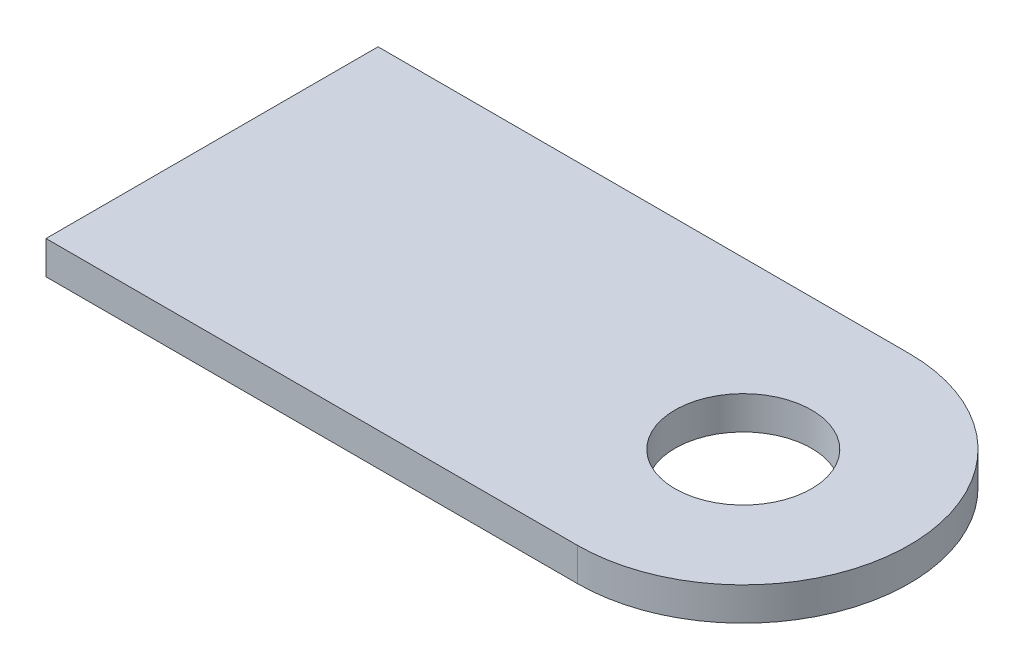
ISO-10303-21;
HEADER;
FILE_DESCRIPTION(('STEP AP214'),'2;1');
FILE_NAME('part.step','',(''),(''),'','','');
FILE_SCHEMA(('AUTOMOTIVE_DESIGN { 1 0 10303 214 1 1 1 1 }'));
ENDSEC;
DATA;
#1=APPLICATION_CONTEXT('core data for automotive mechanical design processes');
#2=APPLICATION_PROTOCOL_DEFINITION('international standard','automotive_design',2000,#1);
#3=PRODUCT_CONTEXT('',#1,'mechanical');
#4=PRODUCT('Part','Part','',(#3));
#5=PRODUCT_RELATED_PRODUCT_CATEGORY('part','',(#4));
#6=PRODUCT_DEFINITION_FORMATION('','',#4);
#7=PRODUCT_DEFINITION_CONTEXT('part definition',#1,'design');
#8=PRODUCT_DEFINITION('design','',#6,#7);
#9=PRODUCT_DEFINITION_SHAPE('','',#8);
#10=(LENGTH_UNIT() NAMED_UNIT(*) SI_UNIT(.MILLI.,.METRE.));
#11=(NAMED_UNIT(*) PLANE_ANGLE_UNIT() SI_UNIT($,.RADIAN.));
#12=(NAMED_UNIT(*) SI_UNIT($,.STERADIAN.) SOLID_ANGLE_UNIT());
#13=UNCERTAINTY_MEASURE_WITH_UNIT(LENGTH_MEASURE(1.E-05),#10,'distance_accuracy_value','');
#14=(GEOMETRIC_REPRESENTATION_CONTEXT(3) GLOBAL_UNCERTAINTY_ASSIGNED_CONTEXT((#13)) GLOBAL_UNIT_ASSIGNED_CONTEXT((#10,
#11,#12)) REPRESENTATION_CONTEXT('',''));
#15=CARTESIAN_POINT('',(0.,0.,0.));
#16=DIRECTION('',(0.,0.,1.));
#17=DIRECTION('',(1.,0.,0.));
#18=AXIS2_PLACEMENT_3D('',#15,#16,#17);
#19=CARTESIAN_POINT('',(0.,1.5875,0.));
#20=DIRECTION('',(0.,-1.,0.));
#21=DIRECTION('',(0.,0.,-1.));
#22=AXIS2_PLACEMENT_3D('',#19,#20,#21);
#23=PLANE('',#22);
#24=DIRECTION('',(0.,0.,1.));
#25=VECTOR('',#24,1.);
#26=CARTESIAN_POINT('',(-25.4,1.5875,7.9375));
#27=LINE('',#26,#25);
#28=CARTESIAN_POINT('',(-25.4,1.5875,-7.9375));
#29=VERTEX_POINT('',#28);
#30=CARTESIAN_POINT('',(-25.4,1.5875,7.9375));
#31=VERTEX_POINT('',#30);
#32=EDGE_CURVE('E91',#29,#31,#27,.T.);
#33=ORIENTED_EDGE('',*,*,#32,.T.);
#34=DIRECTION('',(1.,0.,0.));
#35=VECTOR('',#34,1.);
#36=CARTESIAN_POINT('',(0.,1.5875,7.9375));
#37=LINE('',#36,#35);
#38=CARTESIAN_POINT('',(0.,1.5875,7.9375));
#39=VERTEX_POINT('',#38);
#40=EDGE_CURVE('E86',#31,#39,#37,.T.);
#41=ORIENTED_EDGE('',*,*,#40,.T.);
#42=CARTESIAN_POINT('',(0.,1.5875,0.));
#43=DIRECTION('',(0.,1.,0.));
#44=DIRECTION('',(0.,0.,-1.));
#45=AXIS2_PLACEMENT_3D('',#42,#43,#44);
#46=CIRCLE('',#45,7.9375);
#47=CARTESIAN_POINT('',(0.,1.5875,-7.9375));
#48=VERTEX_POINT('',#47);
#49=EDGE_CURVE('E89',#39,#48,#46,.T.);
#50=ORIENTED_EDGE('',*,*,#49,.T.);
#51=DIRECTION('',(-1.,0.,0.));
#52=VECTOR('',#51,1.);
#53=CARTESIAN_POINT('',(-25.4,1.5875,-7.9375));
#54=LINE('',#53,#52);
#55=EDGE_CURVE('E56',#48,#29,#54,.T.);
#56=ORIENTED_EDGE('',*,*,#55,.T.);
#57=EDGE_LOOP('',(#33,#41,#50,#56));
#58=FACE_BOUND('',#57,.T.);
#59=CARTESIAN_POINT('',(0.,1.5875,0.));
#60=DIRECTION('',(0.,1.,0.));
#61=DIRECTION('',(0.,0.,1.));
#62=AXIS2_PLACEMENT_3D('',#59,#60,#61);
#63=CIRCLE('',#62,3.2639);
#64=CARTESIAN_POINT('',(0.,1.5875,3.2639));
#65=VERTEX_POINT('',#64);
#66=EDGE_CURVE('E106',#65,#65,#63,.T.);
#67=ORIENTED_EDGE('',*,*,#66,.F.);
#68=EDGE_LOOP('',(#67));
#69=FACE_BOUND('',#68,.T.);
#70=ADVANCED_FACE('F39',(#58,#69),#23,.F.);
#71=CARTESIAN_POINT('',(0.,0.,0.));
#72=DIRECTION('',(0.,-1.,0.));
#73=DIRECTION('',(0.,0.,-1.));
#74=AXIS2_PLACEMENT_3D('',#71,#72,#73);
#75=PLANE('',#74);
#76=DIRECTION('',(0.,0.,1.));
#77=VECTOR('',#76,1.);
#78=CARTESIAN_POINT('',(-25.4,0.,7.9375));
#79=LINE('',#78,#77);
#80=CARTESIAN_POINT('',(-25.4,0.,-7.9375));
#81=VERTEX_POINT('',#80);
#82=CARTESIAN_POINT('',(-25.4,0.,7.9375));
#83=VERTEX_POINT('',#82);
#84=EDGE_CURVE('E103',#81,#83,#79,.T.);
#85=ORIENTED_EDGE('',*,*,#84,.F.);
#86=DIRECTION('',(-1.,0.,0.));
#87=VECTOR('',#86,1.);
#88=CARTESIAN_POINT('',(-25.4,0.,-7.9375));
#89=LINE('',#88,#87);
#90=CARTESIAN_POINT('',(0.,0.,-7.9375));
#91=VERTEX_POINT('',#90);
#92=EDGE_CURVE('E79',#91,#81,#89,.T.);
#93=ORIENTED_EDGE('',*,*,#92,.F.);
#94=CARTESIAN_POINT('',(0.,0.,0.));
#95=DIRECTION('',(0.,1.,0.));
#96=DIRECTION('',(0.,0.,-1.));
#97=AXIS2_PLACEMENT_3D('',#94,#95,#96);
#98=CIRCLE('',#97,7.9375);
#99=CARTESIAN_POINT('',(0.,0.,7.9375));
#100=VERTEX_POINT('',#99);
#101=EDGE_CURVE('E73',#100,#91,#98,.T.);
#102=ORIENTED_EDGE('',*,*,#101,.F.);
#103=DIRECTION('',(1.,0.,0.));
#104=VECTOR('',#103,1.);
#105=CARTESIAN_POINT('',(0.,0.,7.9375));
#106=LINE('',#105,#104);
#107=EDGE_CURVE('E95',#83,#100,#106,.T.);
#108=ORIENTED_EDGE('',*,*,#107,.F.);
#109=EDGE_LOOP('',(#85,#93,#102,#108));
#110=FACE_BOUND('',#109,.T.);
#111=CARTESIAN_POINT('',(0.,0.,0.));
#112=DIRECTION('',(0.,1.,0.));
#113=DIRECTION('',(0.,0.,1.));
#114=AXIS2_PLACEMENT_3D('',#111,#112,#113);
#115=CIRCLE('',#114,3.2639);
#116=CARTESIAN_POINT('',(0.,0.,3.2639));
#117=VERTEX_POINT('',#116);
#118=EDGE_CURVE('E118',#117,#117,#115,.T.);
#119=ORIENTED_EDGE('',*,*,#118,.T.);
#120=EDGE_LOOP('',(#119));
#121=FACE_BOUND('',#120,.T.);
#122=ADVANCED_FACE('F114',(#110,#121),#75,.T.);
#123=CARTESIAN_POINT('',(-25.4,1.5875,7.9375));
#124=DIRECTION('',(1.,0.,0.));
#125=DIRECTION('',(0.,0.,-1.));
#126=AXIS2_PLACEMENT_3D('',#123,#124,#125);
#127=PLANE('',#126);
#128=ORIENTED_EDGE('',*,*,#84,.T.);
#129=DIRECTION('',(0.,-1.,0.));
#130=VECTOR('',#129,1.);
#131=CARTESIAN_POINT('',(-25.4,1.5875,7.9375));
#132=LINE('',#131,#130);
#133=EDGE_CURVE('E11',#31,#83,#132,.T.);
#134=ORIENTED_EDGE('',*,*,#133,.F.);
#135=ORIENTED_EDGE('',*,*,#32,.F.);
#136=DIRECTION('',(0.,-1.,0.));
#137=VECTOR('',#136,1.);
#138=CARTESIAN_POINT('',(-25.4,1.5875,-7.9375));
#139=LINE('',#138,#137);
#140=EDGE_CURVE('E99',#29,#81,#139,.T.);
#141=ORIENTED_EDGE('',*,*,#140,.T.);
#142=EDGE_LOOP('',(#128,#134,#135,#141));
#143=FACE_BOUND('',#142,.T.);
#144=ADVANCED_FACE('F41',(#143),#127,.F.);
#145=CARTESIAN_POINT('',(0.,1.5875,7.9375));
#146=DIRECTION('',(0.,0.,-1.));
#147=DIRECTION('',(-1.,0.,0.));
#148=AXIS2_PLACEMENT_3D('',#145,#146,#147);
#149=PLANE('',#148);
#150=ORIENTED_EDGE('',*,*,#107,.T.);
#151=DIRECTION('',(0.,-1.,0.));
#152=VECTOR('',#151,1.);
#153=CARTESIAN_POINT('',(0.,1.5875,7.9375));
#154=LINE('',#153,#152);
#155=EDGE_CURVE('E48',#39,#100,#154,.T.);
#156=ORIENTED_EDGE('',*,*,#155,.F.);
#157=ORIENTED_EDGE('',*,*,#40,.F.);
#158=ORIENTED_EDGE('',*,*,#133,.T.);
#159=EDGE_LOOP('',(#150,#156,#157,#158));
#160=FACE_BOUND('',#159,.T.);
#161=ADVANCED_FACE('F94',(#160),#149,.F.);
#162=CARTESIAN_POINT('',(0.,1.5875,0.));
#163=DIRECTION('',(0.,-1.,0.));
#164=DIRECTION('',(0.,0.,-1.));
#165=AXIS2_PLACEMENT_3D('',#162,#163,#164);
#166=CYLINDRICAL_SURFACE('',#165,7.9375);
#167=ORIENTED_EDGE('',*,*,#101,.T.);
#168=DIRECTION('',(0.,-1.,0.));
#169=VECTOR('',#168,1.);
#170=CARTESIAN_POINT('',(0.,1.5875,-7.9375));
#171=LINE('',#170,#169);
#172=EDGE_CURVE('E96',#48,#91,#171,.T.);
#173=ORIENTED_EDGE('',*,*,#172,.F.);
#174=ORIENTED_EDGE('',*,*,#49,.F.);
#175=ORIENTED_EDGE('',*,*,#155,.T.);
#176=EDGE_LOOP('',(#167,#173,#174,#175));
#177=FACE_BOUND('',#176,.T.);
#178=ADVANCED_FACE('F97',(#177),#166,.T.);
#179=CARTESIAN_POINT('',(-25.4,1.5875,-7.9375));
#180=DIRECTION('',(0.,0.,1.));
#181=DIRECTION('',(1.,0.,0.));
#182=AXIS2_PLACEMENT_3D('',#179,#180,#181);
#183=PLANE('',#182);
#184=ORIENTED_EDGE('',*,*,#92,.T.);
#185=ORIENTED_EDGE('',*,*,#140,.F.);
#186=ORIENTED_EDGE('',*,*,#55,.F.);
#187=ORIENTED_EDGE('',*,*,#172,.T.);
#188=EDGE_LOOP('',(#184,#185,#186,#187));
#189=FACE_BOUND('',#188,.T.);
#190=ADVANCED_FACE('F111',(#189),#183,.F.);
#191=CARTESIAN_POINT('',(0.,1.5875,0.));
#192=DIRECTION('',(0.,-1.,0.));
#193=DIRECTION('',(0.,0.,-1.));
#194=AXIS2_PLACEMENT_3D('',#191,#192,#193);
#195=CYLINDRICAL_SURFACE('',#194,3.2639);
#196=ORIENTED_EDGE('',*,*,#66,.T.);
#197=EDGE_LOOP('',(#196));
#198=FACE_BOUND('',#197,.T.);
#199=ORIENTED_EDGE('',*,*,#118,.F.);
#200=EDGE_LOOP('',(#199));
#201=FACE_BOUND('',#200,.T.);
#202=ADVANCED_FACE('F124',(#198,#201),#195,.F.);
#203=CLOSED_SHELL('',(#70,#122,#144,#161,#178,#190,#202));
#204=MANIFOLD_SOLID_BREP('B2',#203);
#205=ADVANCED_BREP_SHAPE_REPRESENTATION('',(#18,#204),#14);
#206=SHAPE_DEFINITION_REPRESENTATION(#9,#205);
ENDSEC;
END-ISO-10303-21;
